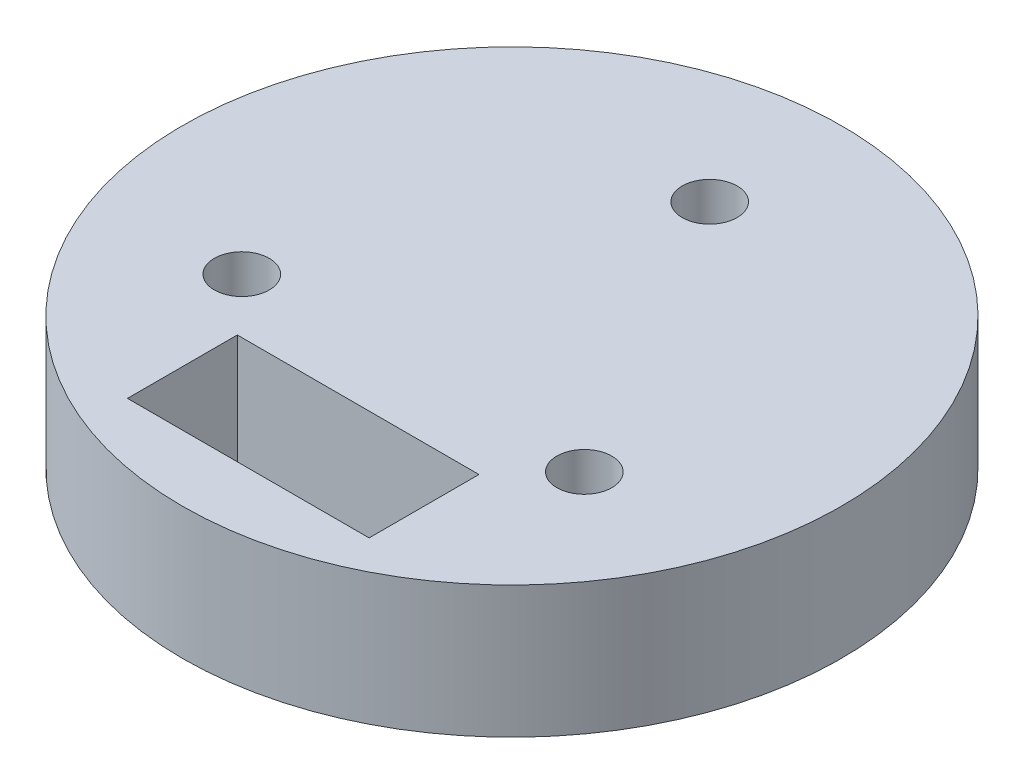
ISO-10303-21;
HEADER;
FILE_DESCRIPTION(('STEP AP214'),'2;1');
FILE_NAME('part.step','',(''),(''),'','','');
FILE_SCHEMA(('AUTOMOTIVE_DESIGN { 1 0 10303 214 1 1 1 1 }'));
ENDSEC;
DATA;
#1=APPLICATION_CONTEXT('core data for automotive mechanical design processes');
#2=APPLICATION_PROTOCOL_DEFINITION('international standard','automotive_design',2000,#1);
#3=PRODUCT_CONTEXT('',#1,'mechanical');
#4=PRODUCT('Part','Part','',(#3));
#5=PRODUCT_RELATED_PRODUCT_CATEGORY('part','',(#4));
#6=PRODUCT_DEFINITION_FORMATION('','',#4);
#7=PRODUCT_DEFINITION_CONTEXT('part definition',#1,'design');
#8=PRODUCT_DEFINITION('design','',#6,#7);
#9=PRODUCT_DEFINITION_SHAPE('','',#8);
#10=(LENGTH_UNIT() NAMED_UNIT(*) SI_UNIT(.MILLI.,.METRE.));
#11=(NAMED_UNIT(*) PLANE_ANGLE_UNIT() SI_UNIT($,.RADIAN.));
#12=(NAMED_UNIT(*) SI_UNIT($,.STERADIAN.) SOLID_ANGLE_UNIT());
#13=UNCERTAINTY_MEASURE_WITH_UNIT(LENGTH_MEASURE(1.E-05),#10,'distance_accuracy_value','');
#14=(GEOMETRIC_REPRESENTATION_CONTEXT(3) GLOBAL_UNCERTAINTY_ASSIGNED_CONTEXT((#13)) GLOBAL_UNIT_ASSIGNED_CONTEXT((#10,
#11,#12)) REPRESENTATION_CONTEXT('',''));
#15=CARTESIAN_POINT('',(0.,0.,0.));
#16=DIRECTION('',(0.,0.,1.));
#17=DIRECTION('',(1.,0.,0.));
#18=AXIS2_PLACEMENT_3D('',#15,#16,#17);
#19=CARTESIAN_POINT('',(0.,6.,0.));
#20=DIRECTION('',(0.,1.,0.));
#21=DIRECTION('',(0.,0.,1.));
#22=AXIS2_PLACEMENT_3D('',#19,#20,#21);
#23=PLANE('',#22);
#24=CARTESIAN_POINT('',(7.79422863405995,6.,4.5));
#25=DIRECTION('',(0.,1.,0.));
#26=DIRECTION('',(0.,0.,1.));
#27=AXIS2_PLACEMENT_3D('',#24,#25,#26);
#28=CIRCLE('',#27,1.25);
#29=CARTESIAN_POINT('',(7.79422863405995,6.,5.75));
#30=VERTEX_POINT('',#29);
#31=EDGE_CURVE('E116',#30,#30,#28,.T.);
#32=ORIENTED_EDGE('',*,*,#31,.F.);
#33=EDGE_LOOP('',(#32));
#34=FACE_BOUND('',#33,.T.);
#35=CARTESIAN_POINT('',(0.,6.,0.));
#36=DIRECTION('',(0.,1.,0.));
#37=DIRECTION('',(0.,0.,1.));
#38=AXIS2_PLACEMENT_3D('',#35,#36,#37);
#39=CIRCLE('',#38,15.);
#40=CARTESIAN_POINT('',(0.,6.,15.));
#41=VERTEX_POINT('',#40);
#42=EDGE_CURVE('E11',#41,#41,#39,.T.);
#43=ORIENTED_EDGE('',*,*,#42,.T.);
#44=EDGE_LOOP('',(#43));
#45=FACE_BOUND('',#44,.T.);
#46=CARTESIAN_POINT('',(0.,6.,-9.));
#47=DIRECTION('',(0.,1.,0.));
#48=DIRECTION('',(0.,0.,1.));
#49=AXIS2_PLACEMENT_3D('',#46,#47,#48);
#50=CIRCLE('',#49,1.25);
#51=CARTESIAN_POINT('',(0.,6.,-7.75));
#52=VERTEX_POINT('',#51);
#53=EDGE_CURVE('E132',#52,#52,#50,.T.);
#54=ORIENTED_EDGE('',*,*,#53,.F.);
#55=EDGE_LOOP('',(#54));
#56=FACE_BOUND('',#55,.T.);
#57=DIRECTION('',(1.,0.,0.));
#58=VECTOR('',#57,1.);
#59=CARTESIAN_POINT('',(-5.5,6.,12.));
#60=LINE('',#59,#58);
#61=CARTESIAN_POINT('',(-5.5,6.,12.));
#62=VERTEX_POINT('',#61);
#63=CARTESIAN_POINT('',(5.5,6.,12.));
#64=VERTEX_POINT('',#63);
#65=EDGE_CURVE('E90',#62,#64,#60,.T.);
#66=ORIENTED_EDGE('',*,*,#65,.F.);
#67=DIRECTION('',(0.,0.,1.));
#68=VECTOR('',#67,1.);
#69=CARTESIAN_POINT('',(-5.5,6.,7.));
#70=LINE('',#69,#68);
#71=CARTESIAN_POINT('',(-5.5,6.,7.));
#72=VERTEX_POINT('',#71);
#73=EDGE_CURVE('E81',#72,#62,#70,.T.);
#74=ORIENTED_EDGE('',*,*,#73,.F.);
#75=DIRECTION('',(-1.,0.,0.));
#76=VECTOR('',#75,1.);
#77=CARTESIAN_POINT('',(-5.5,6.,7.));
#78=LINE('',#77,#76);
#79=CARTESIAN_POINT('',(5.5,6.,7.));
#80=VERTEX_POINT('',#79);
#81=EDGE_CURVE('E108',#80,#72,#78,.T.);
#82=ORIENTED_EDGE('',*,*,#81,.F.);
#83=DIRECTION('',(0.,0.,-1.));
#84=VECTOR('',#83,1.);
#85=CARTESIAN_POINT('',(5.5,6.,7.));
#86=LINE('',#85,#84);
#87=EDGE_CURVE('E104',#64,#80,#86,.T.);
#88=ORIENTED_EDGE('',*,*,#87,.F.);
#89=EDGE_LOOP('',(#66,#74,#82,#88));
#90=FACE_BOUND('',#89,.T.);
#91=CARTESIAN_POINT('',(-7.79422863405995,6.,4.5));
#92=DIRECTION('',(0.,1.,0.));
#93=DIRECTION('',(0.,0.,1.));
#94=AXIS2_PLACEMENT_3D('',#91,#92,#93);
#95=CIRCLE('',#94,1.25);
#96=CARTESIAN_POINT('',(-7.79422863405995,6.,5.75));
#97=VERTEX_POINT('',#96);
#98=EDGE_CURVE('E180',#97,#97,#95,.T.);
#99=ORIENTED_EDGE('',*,*,#98,.F.);
#100=EDGE_LOOP('',(#99));
#101=FACE_BOUND('',#100,.T.);
#102=ADVANCED_FACE('F39',(#34,#45,#56,#90,#101),#23,.T.);
#103=CARTESIAN_POINT('',(0.,0.,0.));
#104=DIRECTION('',(0.,1.,0.));
#105=DIRECTION('',(0.,0.,1.));
#106=AXIS2_PLACEMENT_3D('',#103,#104,#105);
#107=PLANE('',#106);
#108=CARTESIAN_POINT('',(0.,0.,-9.));
#109=DIRECTION('',(0.,1.,0.));
#110=DIRECTION('',(0.,0.,1.));
#111=AXIS2_PLACEMENT_3D('',#108,#109,#110);
#112=CIRCLE('',#111,1.25);
#113=CARTESIAN_POINT('',(0.,0.,-7.75));
#114=VERTEX_POINT('',#113);
#115=EDGE_CURVE('E99',#114,#114,#112,.T.);
#116=ORIENTED_EDGE('',*,*,#115,.T.);
#117=EDGE_LOOP('',(#116));
#118=FACE_BOUND('',#117,.T.);
#119=CARTESIAN_POINT('',(0.,0.,0.));
#120=DIRECTION('',(0.,1.,0.));
#121=DIRECTION('',(0.,0.,1.));
#122=AXIS2_PLACEMENT_3D('',#119,#120,#121);
#123=CIRCLE('',#122,15.);
#124=CARTESIAN_POINT('',(0.,0.,15.));
#125=VERTEX_POINT('',#124);
#126=EDGE_CURVE('E43',#125,#125,#123,.T.);
#127=ORIENTED_EDGE('',*,*,#126,.F.);
#128=EDGE_LOOP('',(#127));
#129=FACE_BOUND('',#128,.T.);
#130=DIRECTION('',(0.,0.,1.));
#131=VECTOR('',#130,1.);
#132=CARTESIAN_POINT('',(-5.5,0.,7.));
#133=LINE('',#132,#131);
#134=CARTESIAN_POINT('',(-5.5,0.,7.));
#135=VERTEX_POINT('',#134);
#136=CARTESIAN_POINT('',(-5.5,0.,12.));
#137=VERTEX_POINT('',#136);
#138=EDGE_CURVE('E63',#135,#137,#133,.T.);
#139=ORIENTED_EDGE('',*,*,#138,.T.);
#140=DIRECTION('',(1.,0.,0.));
#141=VECTOR('',#140,1.);
#142=CARTESIAN_POINT('',(-5.5,0.,12.));
#143=LINE('',#142,#141);
#144=CARTESIAN_POINT('',(5.5,0.,12.));
#145=VERTEX_POINT('',#144);
#146=EDGE_CURVE('E97',#137,#145,#143,.T.);
#147=ORIENTED_EDGE('',*,*,#146,.T.);
#148=DIRECTION('',(0.,0.,-1.));
#149=VECTOR('',#148,1.);
#150=CARTESIAN_POINT('',(5.5,0.,7.));
#151=LINE('',#150,#149);
#152=CARTESIAN_POINT('',(5.5,0.,7.));
#153=VERTEX_POINT('',#152);
#154=EDGE_CURVE('E119',#145,#153,#151,.T.);
#155=ORIENTED_EDGE('',*,*,#154,.T.);
#156=DIRECTION('',(-1.,0.,0.));
#157=VECTOR('',#156,1.);
#158=CARTESIAN_POINT('',(-5.5,0.,7.));
#159=LINE('',#158,#157);
#160=EDGE_CURVE('E91',#153,#135,#159,.T.);
#161=ORIENTED_EDGE('',*,*,#160,.T.);
#162=EDGE_LOOP('',(#139,#147,#155,#161));
#163=FACE_BOUND('',#162,.T.);
#164=CARTESIAN_POINT('',(7.79422863405995,0.,4.5));
#165=DIRECTION('',(0.,1.,0.));
#166=DIRECTION('',(0.,0.,1.));
#167=AXIS2_PLACEMENT_3D('',#164,#165,#166);
#168=CIRCLE('',#167,1.25);
#169=CARTESIAN_POINT('',(7.79422863405995,0.,5.75));
#170=VERTEX_POINT('',#169);
#171=EDGE_CURVE('E174',#170,#170,#168,.T.);
#172=ORIENTED_EDGE('',*,*,#171,.T.);
#173=EDGE_LOOP('',(#172));
#174=FACE_BOUND('',#173,.T.);
#175=CARTESIAN_POINT('',(-7.79422863405995,0.,4.5));
#176=DIRECTION('',(0.,1.,0.));
#177=DIRECTION('',(0.,0.,1.));
#178=AXIS2_PLACEMENT_3D('',#175,#176,#177);
#179=CIRCLE('',#178,1.25);
#180=CARTESIAN_POINT('',(-7.79422863405995,0.,5.75));
#181=VERTEX_POINT('',#180);
#182=EDGE_CURVE('E177',#181,#181,#179,.T.);
#183=ORIENTED_EDGE('',*,*,#182,.T.);
#184=EDGE_LOOP('',(#183));
#185=FACE_BOUND('',#184,.T.);
#186=ADVANCED_FACE('F140',(#118,#129,#163,#174,#185),#107,.F.);
#187=CARTESIAN_POINT('',(0.,6.,0.));
#188=DIRECTION('',(0.,-1.,0.));
#189=DIRECTION('',(0.,0.,-1.));
#190=AXIS2_PLACEMENT_3D('',#187,#188,#189);
#191=CYLINDRICAL_SURFACE('',#190,15.);
#192=ORIENTED_EDGE('',*,*,#42,.F.);
#193=EDGE_LOOP('',(#192));
#194=FACE_BOUND('',#193,.T.);
#195=ORIENTED_EDGE('',*,*,#126,.T.);
#196=EDGE_LOOP('',(#195));
#197=FACE_BOUND('',#196,.T.);
#198=ADVANCED_FACE('F41',(#194,#197),#191,.T.);
#199=CARTESIAN_POINT('',(0.,6.,-9.));
#200=DIRECTION('',(0.,-1.,0.));
#201=DIRECTION('',(0.,0.,-1.));
#202=AXIS2_PLACEMENT_3D('',#199,#200,#201);
#203=CYLINDRICAL_SURFACE('',#202,1.25);
#204=ORIENTED_EDGE('',*,*,#53,.T.);
#205=EDGE_LOOP('',(#204));
#206=FACE_BOUND('',#205,.T.);
#207=ORIENTED_EDGE('',*,*,#115,.F.);
#208=EDGE_LOOP('',(#207));
#209=FACE_BOUND('',#208,.T.);
#210=ADVANCED_FACE('F143',(#206,#209),#203,.F.);
#211=CARTESIAN_POINT('',(-5.5,6.,7.));
#212=DIRECTION('',(1.,0.,0.));
#213=DIRECTION('',(0.,0.,-1.));
#214=AXIS2_PLACEMENT_3D('',#211,#212,#213);
#215=PLANE('',#214);
#216=ORIENTED_EDGE('',*,*,#138,.F.);
#217=DIRECTION('',(0.,-1.,0.));
#218=VECTOR('',#217,1.);
#219=CARTESIAN_POINT('',(-5.5,6.,7.));
#220=LINE('',#219,#218);
#221=EDGE_CURVE('E85',#72,#135,#220,.T.);
#222=ORIENTED_EDGE('',*,*,#221,.F.);
#223=ORIENTED_EDGE('',*,*,#73,.T.);
#224=DIRECTION('',(0.,-1.,0.));
#225=VECTOR('',#224,1.);
#226=CARTESIAN_POINT('',(-5.5,6.,12.));
#227=LINE('',#226,#225);
#228=EDGE_CURVE('E84',#62,#137,#227,.T.);
#229=ORIENTED_EDGE('',*,*,#228,.T.);
#230=EDGE_LOOP('',(#216,#222,#223,#229));
#231=FACE_BOUND('',#230,.T.);
#232=ADVANCED_FACE('F83',(#231),#215,.T.);
#233=CARTESIAN_POINT('',(-5.5,6.,12.));
#234=DIRECTION('',(0.,0.,-1.));
#235=DIRECTION('',(-1.,0.,0.));
#236=AXIS2_PLACEMENT_3D('',#233,#234,#235);
#237=PLANE('',#236);
#238=ORIENTED_EDGE('',*,*,#146,.F.);
#239=ORIENTED_EDGE('',*,*,#228,.F.);
#240=ORIENTED_EDGE('',*,*,#65,.T.);
#241=DIRECTION('',(0.,-1.,0.));
#242=VECTOR('',#241,1.);
#243=CARTESIAN_POINT('',(5.5,6.,12.));
#244=LINE('',#243,#242);
#245=EDGE_CURVE('E100',#64,#145,#244,.T.);
#246=ORIENTED_EDGE('',*,*,#245,.T.);
#247=EDGE_LOOP('',(#238,#239,#240,#246));
#248=FACE_BOUND('',#247,.T.);
#249=ADVANCED_FACE('F94',(#248),#237,.T.);
#250=CARTESIAN_POINT('',(5.5,6.,7.));
#251=DIRECTION('',(-1.,0.,0.));
#252=DIRECTION('',(0.,0.,1.));
#253=AXIS2_PLACEMENT_3D('',#250,#251,#252);
#254=PLANE('',#253);
#255=ORIENTED_EDGE('',*,*,#154,.F.);
#256=ORIENTED_EDGE('',*,*,#245,.F.);
#257=ORIENTED_EDGE('',*,*,#87,.T.);
#258=DIRECTION('',(0.,-1.,0.));
#259=VECTOR('',#258,1.);
#260=CARTESIAN_POINT('',(5.5,6.,7.));
#261=LINE('',#260,#259);
#262=EDGE_CURVE('E55',#80,#153,#261,.T.);
#263=ORIENTED_EDGE('',*,*,#262,.T.);
#264=EDGE_LOOP('',(#255,#256,#257,#263));
#265=FACE_BOUND('',#264,.T.);
#266=ADVANCED_FACE('F201',(#265),#254,.T.);
#267=CARTESIAN_POINT('',(-5.5,6.,7.));
#268=DIRECTION('',(0.,0.,1.));
#269=DIRECTION('',(1.,0.,0.));
#270=AXIS2_PLACEMENT_3D('',#267,#268,#269);
#271=PLANE('',#270);
#272=ORIENTED_EDGE('',*,*,#160,.F.);
#273=ORIENTED_EDGE('',*,*,#262,.F.);
#274=ORIENTED_EDGE('',*,*,#81,.T.);
#275=ORIENTED_EDGE('',*,*,#221,.T.);
#276=EDGE_LOOP('',(#272,#273,#274,#275));
#277=FACE_BOUND('',#276,.T.);
#278=ADVANCED_FACE('F193',(#277),#271,.T.);
#279=CARTESIAN_POINT('',(7.79422863405995,6.,4.5));
#280=DIRECTION('',(0.,-1.,0.));
#281=DIRECTION('',(0.,0.,-1.));
#282=AXIS2_PLACEMENT_3D('',#279,#280,#281);
#283=CYLINDRICAL_SURFACE('',#282,1.25);
#284=ORIENTED_EDGE('',*,*,#31,.T.);
#285=EDGE_LOOP('',(#284));
#286=FACE_BOUND('',#285,.T.);
#287=ORIENTED_EDGE('',*,*,#171,.F.);
#288=EDGE_LOOP('',(#287));
#289=FACE_BOUND('',#288,.T.);
#290=ADVANCED_FACE('F189',(#286,#289),#283,.F.);
#291=CARTESIAN_POINT('',(-7.79422863405995,6.,4.5));
#292=DIRECTION('',(0.,-1.,0.));
#293=DIRECTION('',(0.,0.,-1.));
#294=AXIS2_PLACEMENT_3D('',#291,#292,#293);
#295=CYLINDRICAL_SURFACE('',#294,1.25);
#296=ORIENTED_EDGE('',*,*,#98,.T.);
#297=EDGE_LOOP('',(#296));
#298=FACE_BOUND('',#297,.T.);
#299=ORIENTED_EDGE('',*,*,#182,.F.);
#300=EDGE_LOOP('',(#299));
#301=FACE_BOUND('',#300,.T.);
#302=ADVANCED_FACE('F192',(#298,#301),#295,.F.);
#303=CLOSED_SHELL('',(#102,#186,#198,#210,#232,#249,#266,#278,#290,#302));
#304=MANIFOLD_SOLID_BREP('B2',#303);
#305=ADVANCED_BREP_SHAPE_REPRESENTATION('',(#18,#304),#14);
#306=SHAPE_DEFINITION_REPRESENTATION(#9,#305);
ENDSEC;
END-ISO-10303-21;
